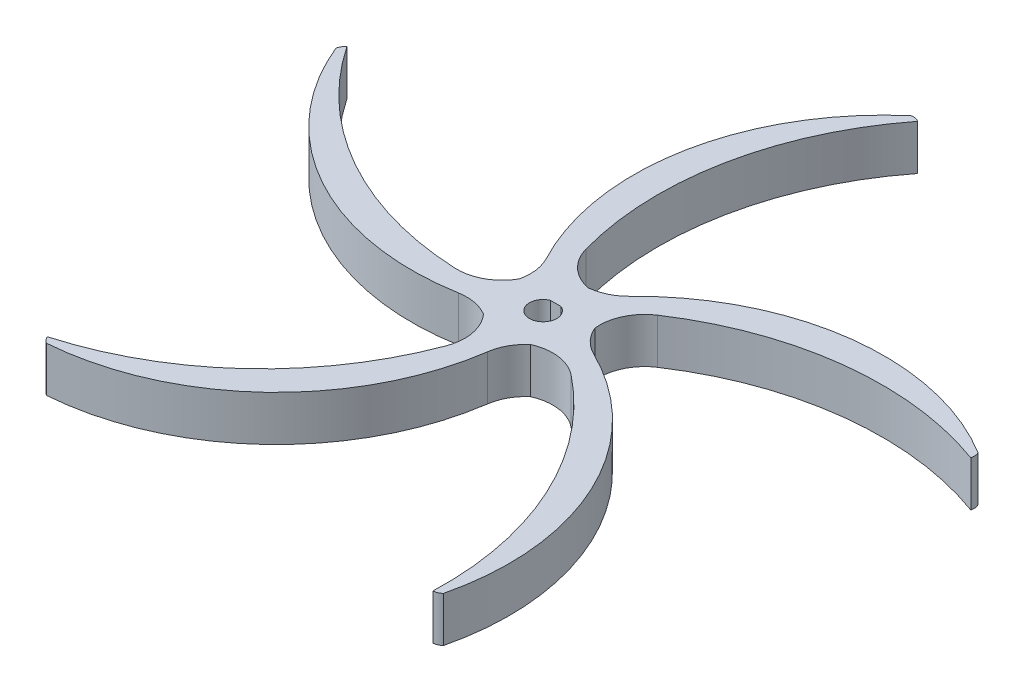
ISO-10303-21;
HEADER;
FILE_DESCRIPTION(('STEP AP214'),'2;1');
FILE_NAME('part.step','',(''),(''),'','','');
FILE_SCHEMA(('AUTOMOTIVE_DESIGN { 1 0 10303 214 1 1 1 1 }'));
ENDSEC;
DATA;
#1=APPLICATION_CONTEXT('core data for automotive mechanical design processes');
#2=APPLICATION_PROTOCOL_DEFINITION('international standard','automotive_design',2000,#1);
#3=PRODUCT_CONTEXT('',#1,'mechanical');
#4=PRODUCT('Part','Part','',(#3));
#5=PRODUCT_RELATED_PRODUCT_CATEGORY('part','',(#4));
#6=PRODUCT_DEFINITION_FORMATION('','',#4);
#7=PRODUCT_DEFINITION_CONTEXT('part definition',#1,'design');
#8=PRODUCT_DEFINITION('design','',#6,#7);
#9=PRODUCT_DEFINITION_SHAPE('','',#8);
#10=(LENGTH_UNIT() NAMED_UNIT(*) SI_UNIT(.MILLI.,.METRE.));
#11=(NAMED_UNIT(*) PLANE_ANGLE_UNIT() SI_UNIT($,.RADIAN.));
#12=(NAMED_UNIT(*) SI_UNIT($,.STERADIAN.) SOLID_ANGLE_UNIT());
#13=UNCERTAINTY_MEASURE_WITH_UNIT(LENGTH_MEASURE(1.E-05),#10,'distance_accuracy_value','');
#14=(GEOMETRIC_REPRESENTATION_CONTEXT(3) GLOBAL_UNCERTAINTY_ASSIGNED_CONTEXT((#13)) GLOBAL_UNIT_ASSIGNED_CONTEXT((#10,
#11,#12)) REPRESENTATION_CONTEXT('',''));
#15=CARTESIAN_POINT('',(0.,0.,0.));
#16=DIRECTION('',(0.,0.,1.));
#17=DIRECTION('',(1.,0.,0.));
#18=AXIS2_PLACEMENT_3D('',#15,#16,#17);
#19=CARTESIAN_POINT('',(0.,0.,0.));
#20=DIRECTION('',(0.,1.,0.));
#21=DIRECTION('',(0.,0.,1.));
#22=AXIS2_PLACEMENT_3D('',#19,#20,#21);
#23=PLANE('',#22);
#24=CARTESIAN_POINT('',(2.59805635797886,0.,-19.1456598362845));
#25=DIRECTION('',(0.,1.,0.));
#26=DIRECTION('',(0.,0.,1.));
#27=AXIS2_PLACEMENT_3D('',#24,#25,#26);
#28=CIRCLE('',#27,10.);
#29=CARTESIAN_POINT('',(-7.03824597740475,0.,-16.4732681544608));
#30=VERTEX_POINT('',#29);
#31=CARTESIAN_POINT('',(0.551785466364731,0.,-9.35725979142876));
#32=VERTEX_POINT('',#31);
#33=EDGE_CURVE('E444',#30,#32,#28,.T.);
#34=ORIENTED_EDGE('',*,*,#33,.T.);
#35=CARTESIAN_POINT('',(-0.329885574622799,0.,-19.3183167722659));
#36=DIRECTION('',(0.,1.,0.));
#37=DIRECTION('',(0.,0.,1.));
#38=AXIS2_PLACEMENT_3D('',#35,#36,#37);
#39=CIRCLE('',#38,10.);
#40=CARTESIAN_POINT('',(6.84598257952221,0.,-12.3536260946889));
#41=VERTEX_POINT('',#40);
#42=EDGE_CURVE('E447',#32,#41,#39,.T.);
#43=ORIENTED_EDGE('',*,*,#42,.T.);
#44=CARTESIAN_POINT('',(46.4009814470581,0.,26.0373150355719));
#45=DIRECTION('',(0.,1.,0.));
#46=DIRECTION('',(0.95105651629515,0.,-0.309016994374958));
#47=AXIS2_PLACEMENT_3D('',#44,#45,#46);
#48=CIRCLE('',#47,55.1222486504126);
#49=CARTESIAN_POINT('',(75.3173797078284,0.,-20.8913990731957));
#50=VERTEX_POINT('',#49);
#51=EDGE_CURVE('E260',#50,#41,#48,.T.);
#52=ORIENTED_EDGE('',*,*,#51,.F.);
#53=CARTESIAN_POINT('',(73.0753940921329,0.,-19.7803009962848));
#54=DIRECTION('',(0.,1.,0.));
#55=DIRECTION('',(0.95105651629515,0.,-0.309016994374958));
#56=AXIS2_PLACEMENT_3D('',#53,#54,#55);
#57=CIRCLE('',#56,2.50220671358312);
#58=CARTESIAN_POINT('',(75.4885456026814,0.,-19.1186831121264));
#59=VERTEX_POINT('',#58);
#60=EDGE_CURVE('E270',#59,#50,#57,.T.);
#61=ORIENTED_EDGE('',*,*,#60,.F.);
#62=CARTESIAN_POINT('',(51.7649077058266,0.,46.0395552573921));
#63=DIRECTION('',(0.,-1.,0.));
#64=DIRECTION('',(0.95105651629515,0.,-0.309016994374958));
#65=AXIS2_PLACEMENT_3D('',#62,#63,#64);
#66=CIRCLE('',#65,69.3426782182522);
#67=CARTESIAN_POINT('',(13.4920714053681,0.,-11.7842895127231));
#68=VERTEX_POINT('',#67);
#69=EDGE_CURVE('E254',#68,#59,#66,.T.);
#70=ORIENTED_EDGE('',*,*,#69,.F.);
#71=CARTESIAN_POINT('',(19.0114481130281,0.,-3.44543582897617));
#72=DIRECTION('',(0.,1.,0.));
#73=DIRECTION('',(0.,0.,1.));
#74=AXIS2_PLACEMENT_3D('',#71,#72,#73);
#75=CIRCLE('',#74,10.);
#76=CARTESIAN_POINT('',(9.06979398566074,0.,-2.36677313294975));
#77=VERTEX_POINT('',#76);
#78=EDGE_CURVE('E438',#68,#77,#75,.T.);
#79=ORIENTED_EDGE('',*,*,#78,.T.);
#80=CARTESIAN_POINT('',(18.2708708013598,0.,-6.28342801072549));
#81=DIRECTION('',(0.,1.,0.));
#82=DIRECTION('',(0.,0.,1.));
#83=AXIS2_PLACEMENT_3D('',#80,#81,#82);
#84=CIRCLE('',#83,10.);
#85=CARTESIAN_POINT('',(13.8645215574949,0.,2.69343593728504));
#86=VERTEX_POINT('',#85);
#87=EDGE_CURVE('E429',#77,#86,#84,.T.);
#88=ORIENTED_EDGE('',*,*,#87,.T.);
#89=CARTESIAN_POINT('',(-10.424266308593,0.,52.1759286016012));
#90=DIRECTION('',(0.,1.,0.));
#91=DIRECTION('',(0.58778525229248,0.,0.809016994374942));
#92=AXIS2_PLACEMENT_3D('',#89,#90,#91);
#93=CIRCLE('',#92,55.1222486504126);
#94=CARTESIAN_POINT('',(43.1432515245949,0.,65.1752874115201));
#95=VERTEX_POINT('',#94);
#96=EDGE_CURVE('E288',#95,#86,#93,.T.);
#97=ORIENTED_EDGE('',*,*,#96,.F.);
#98=CARTESIAN_POINT('',(41.3937228019117,0.,63.3863805704558));
#99=DIRECTION('',(0.,1.,0.));
#100=DIRECTION('',(0.58778525229248,0.,0.809016994374942));
#101=AXIS2_PLACEMENT_3D('',#98,#99,#100);
#102=CIRCLE('',#101,2.50220671358312);
#103=CARTESIAN_POINT('',(41.5101916286465,0.,65.8858752093577));
#104=VERTEX_POINT('',#103);
#105=EDGE_CURVE('E298',#104,#95,#102,.T.);
#106=ORIENTED_EDGE('',*,*,#105,.F.);
#107=CARTESIAN_POINT('',(-27.7899828415226,0.,63.4583577770421));
#108=DIRECTION('',(0.,-1.,0.));
#109=DIRECTION('',(0.58778525229248,0.,0.809016994374942));
#110=AXIS2_PLACEMENT_3D('',#107,#108,#109);
#111=CIRCLE('',#110,69.3426782182522);
#112=CARTESIAN_POINT('',(15.376804684563,0.,9.19017670232898));
#113=VERTEX_POINT('',#112);
#114=EDGE_CURVE('E283',#113,#104,#111,.T.);
#115=ORIENTED_EDGE('',*,*,#114,.F.);
#116=CARTESIAN_POINT('',(9.15166475122775,0.,17.0162633879207));
#117=DIRECTION('',(0.,1.,0.));
#118=DIRECTION('',(0.,0.,1.));
#119=AXIS2_PLACEMENT_3D('',#116,#117,#118);
#120=CIRCLE('',#119,10.);
#121=CARTESIAN_POINT('',(5.053655487733,0.,7.89451355160574));
#122=VERTEX_POINT('',#121);
#123=EDGE_CURVE('E11',#113,#122,#120,.T.);
#124=ORIENTED_EDGE('',*,*,#123,.T.);
#125=CARTESIAN_POINT('',(11.6219047339211,0.,15.4349446957744));
#126=DIRECTION('',(0.,1.,0.));
#127=DIRECTION('',(0.,0.,1.));
#128=AXIS2_PLACEMENT_3D('',#125,#126,#127);
#129=CIRCLE('',#128,10.);
#130=CARTESIAN_POINT('',(1.72276298076522,0.,14.0182610504515));
#131=VERTEX_POINT('',#130);
#132=EDGE_CURVE('E477',#122,#131,#129,.T.);
#133=ORIENTED_EDGE('',*,*,#132,.T.);
#134=CARTESIAN_POINT('',(-52.8435323335489,0.,6.2091822348051));
#135=DIRECTION('',(0.,1.,0.));
#136=DIRECTION('',(-0.587785252292469,0.,0.809016994374951));
#137=AXIS2_PLACEMENT_3D('',#134,#135,#136);
#138=CIRCLE('',#137,55.1222486504126);
#139=CARTESIAN_POINT('',(-48.6533838804433,0.,61.1719419200579));
#140=VERTEX_POINT('',#139);
#141=EDGE_CURVE('E316',#140,#131,#138,.T.);
#142=ORIENTED_EDGE('',*,*,#141,.F.);
#143=CARTESIAN_POINT('',(-47.4926664796602,0.,58.9552386126621));
#144=DIRECTION('',(0.,1.,0.));
#145=DIRECTION('',(-0.587785252292469,0.,0.809016994374951));
#146=AXIS2_PLACEMENT_3D('',#143,#144,#145);
#147=CIRCLE('',#146,2.50220671358312);
#148=CARTESIAN_POINT('',(-49.8338362966567,0.,59.8383933700433));
#149=VERTEX_POINT('',#148);
#150=EDGE_CURVE('E325',#149,#140,#147,.T.);
#151=ORIENTED_EDGE('',*,*,#150,.F.);
#152=CARTESIAN_POINT('',(-68.9400616486638,0.,-6.82013328092916));
#153=DIRECTION('',(0.,-1.,0.));
#154=DIRECTION('',(-0.587785252292469,0.,0.809016994374951));
#155=AXIS2_PLACEMENT_3D('',#152,#153,#154);
#156=CIRCLE('',#155,69.3426782182522);
#157=CARTESIAN_POINT('',(-3.98868347193967,0.,17.4641310773798));
#158=VERTEX_POINT('',#157);
#159=EDGE_CURVE('E311',#158,#149,#156,.T.);
#160=ORIENTED_EDGE('',*,*,#159,.F.);
#161=CARTESIAN_POINT('',(-13.3554082431251,0.,13.9620649642315));
#162=DIRECTION('',(0.,1.,0.));
#163=DIRECTION('',(0.,0.,1.));
#164=AXIS2_PLACEMENT_3D('',#161,#162,#163);
#165=CIRCLE('',#164,10.);
#166=CARTESIAN_POINT('',(-5.94646312680934,0.,7.24585083248871));
#167=VERTEX_POINT('',#166);
#168=EDGE_CURVE('E474',#158,#167,#165,.T.);
#169=ORIENTED_EDGE('',*,*,#168,.T.);
#170=CARTESIAN_POINT('',(-11.0881386617834,0.,15.8227484471889));
#171=DIRECTION('',(0.,1.,0.));
#172=DIRECTION('',(0.,0.,1.));
#173=AXIS2_PLACEMENT_3D('',#170,#171,#172);
#174=CIRCLE('',#173,10.);
#175=CARTESIAN_POINT('',(-12.799795480822,0.,5.97032585506269));
#176=VERTEX_POINT('',#175);
#177=EDGE_CURVE('E465',#167,#176,#174,.T.);
#178=ORIENTED_EDGE('',*,*,#177,.T.);
#179=CARTESIAN_POINT('',(-22.234832759144,0.,-48.3384429381496));
#180=DIRECTION('',(0.,1.,0.));
#181=DIRECTION('',(-0.951056516295155,0.,-0.309016994374945));
#182=AXIS2_PLACEMENT_3D('',#179,#180,#181);
#183=CIRCLE('',#182,55.1222486504126);
#184=CARTESIAN_POINT('',(-73.2126964304048,0.,-27.3689481470902));
#185=VERTEX_POINT('',#184);
#186=EDGE_CURVE('E343',#185,#176,#183,.T.);
#187=ORIENTED_EDGE('',*,*,#186,.F.);
#188=CARTESIAN_POINT('',(-70.7458049027042,0.,-26.9500392929708));
#189=DIRECTION('',(0.,1.,0.));
#190=DIRECTION('',(-0.951056516295155,0.,-0.309016994374945));
#191=AXIS2_PLACEMENT_3D('',#188,#189,#190);
#192=CIRCLE('',#191,2.50220671358312);
#193=CARTESIAN_POINT('',(-72.3091962497783,0.,-28.9037142744849));
#194=VERTEX_POINT('',#193);
#195=EDGE_CURVE('E353',#194,#185,#192,.T.);
#196=ORIENTED_EDGE('',*,*,#195,.F.);
#197=CARTESIAN_POINT('',(-14.8173184438644,0.,-67.6734319524606));
#198=DIRECTION('',(0.,-1.,0.));
#199=DIRECTION('',(-0.951056516295155,0.,-0.309016994374945));
#200=AXIS2_PLACEMENT_3D('',#197,#198,#199);
#201=CIRCLE('',#200,69.3426782182522);
#202=CARTESIAN_POINT('',(-17.8419466405866,0.,1.60324988747496));
#203=VERTEX_POINT('',#202);
#204=EDGE_CURVE('E338',#203,#194,#201,.T.);
#205=ORIENTED_EDGE('',*,*,#204,.F.);
#206=CARTESIAN_POINT('',(-17.4057609791095,0.,-8.3872326868916));
#207=DIRECTION('',(0.,1.,0.));
#208=DIRECTION('',(0.,0.,1.));
#209=AXIS2_PLACEMENT_3D('',#206,#207,#208);
#210=CIRCLE('',#209,10.);
#211=CARTESIAN_POINT('',(-8.72877181294912,0.,-3.41633145971603));
#212=VERTEX_POINT('',#211);
#213=EDGE_CURVE('E456',#203,#212,#210,.T.);
#214=ORIENTED_EDGE('',*,*,#213,.T.);
#215=CARTESIAN_POINT('',(-18.4747512988749,0.,-5.65594835997216));
#216=DIRECTION('',(0.,1.,0.));
#217=DIRECTION('',(0.,0.,1.));
#218=AXIS2_PLACEMENT_3D('',#215,#216,#217);
#219=CIRCLE('',#218,10.);
#220=CARTESIAN_POINT('',(-9.63347163696042,0.,-10.3283967481105));
#221=VERTEX_POINT('',#220);
#222=EDGE_CURVE('E459',#212,#221,#219,.T.);
#223=ORIENTED_EDGE('',*,*,#222,.T.);
#224=CARTESIAN_POINT('',(39.1016499542284,0.,-36.0839829338286));
#225=DIRECTION('',(0.,1.,0.));
#226=DIRECTION('',(0.,0.,-1.));
#227=AXIS2_PLACEMENT_3D('',#224,#225,#226);
#228=CIRCLE('',#227,55.1222486504126);
#229=CARTESIAN_POINT('',(3.4054490784254,0.,-78.086882111293));
#230=VERTEX_POINT('',#229);
#231=EDGE_CURVE('E371',#230,#221,#228,.T.);
#232=ORIENTED_EDGE('',*,*,#231,.F.);
#233=CARTESIAN_POINT('',(3.7693544883204,0.,-75.611278893863));
#234=DIRECTION('',(0.,1.,0.));
#235=DIRECTION('',(0.,0.,-1.));
#236=AXIS2_PLACEMENT_3D('',#233,#234,#235);
#237=CIRCLE('',#236,2.50220671358312);
#238=CARTESIAN_POINT('',(5.14429531510767,0.,-77.7018711927903));
#239=VERTEX_POINT('',#238);
#240=EDGE_CURVE('E381',#239,#230,#237,.T.);
#241=ORIENTED_EDGE('',*,*,#240,.F.);
#242=CARTESIAN_POINT('',(59.782455228225,0.,-35.0043478010443));
#243=DIRECTION('',(0.,-1.,0.));
#244=DIRECTION('',(0.,0.,-1.));
#245=AXIS2_PLACEMENT_3D('',#242,#243,#244);
#246=CIRCLE('',#245,69.3426782182522);
#247=EDGE_CURVE('E366',#30,#239,#246,.T.);
#248=ORIENTED_EDGE('',*,*,#247,.F.);
#249=EDGE_LOOP('',(#34,#43,#52,#61,#70,#79,#88,#97,#106,#115,#124,#133,#142,#151,#160,#169,#178,
#187,#196,#205,#214,#223,#232,#241,#248));
#250=FACE_BOUND('',#249,.T.);
#251=DIRECTION('',(1.,0.,0.));
#252=VECTOR('',#251,1.);
#253=CARTESIAN_POINT('',(0.,0.,-2.78));
#254=LINE('',#253,#252);
#255=CARTESIAN_POINT('',(-1.19257075261806,0.,-2.78));
#256=VERTEX_POINT('',#255);
#257=CARTESIAN_POINT('',(1.19257075261806,0.,-2.78));
#258=VERTEX_POINT('',#257);
#259=EDGE_CURVE('E229',#256,#258,#254,.T.);
#260=ORIENTED_EDGE('',*,*,#259,.F.);
#261=CARTESIAN_POINT('',(0.,0.,0.));
#262=DIRECTION('',(0.,1.,0.));
#263=DIRECTION('',(0.,0.,1.));
#264=AXIS2_PLACEMENT_3D('',#261,#262,#263);
#265=CIRCLE('',#264,3.025);
#266=EDGE_CURVE('E238',#256,#258,#265,.T.);
#267=ORIENTED_EDGE('',*,*,#266,.T.);
#268=EDGE_LOOP('',(#260,#267));
#269=FACE_BOUND('',#268,.T.);
#270=ADVANCED_FACE('F44',(#250,#269),#23,.F.);
#271=CARTESIAN_POINT('',(0.,10.,0.));
#272=DIRECTION('',(0.,1.,0.));
#273=DIRECTION('',(0.,0.,1.));
#274=AXIS2_PLACEMENT_3D('',#271,#272,#273);
#275=PLANE('',#274);
#276=CARTESIAN_POINT('',(18.2708708013598,10.,-6.28342801072549));
#277=DIRECTION('',(0.,1.,0.));
#278=DIRECTION('',(0.,0.,1.));
#279=AXIS2_PLACEMENT_3D('',#276,#277,#278);
#280=CIRCLE('',#279,10.);
#281=CARTESIAN_POINT('',(13.8645215574949,10.,2.69343593728504));
#282=VERTEX_POINT('',#281);
#283=CARTESIAN_POINT('',(9.06979398566074,10.,-2.36677313294975));
#284=VERTEX_POINT('',#283);
#285=EDGE_CURVE('E432',#282,#284,#280,.F.);
#286=ORIENTED_EDGE('',*,*,#285,.T.);
#287=CARTESIAN_POINT('',(19.0114481130281,10.,-3.44543582897617));
#288=DIRECTION('',(0.,1.,0.));
#289=DIRECTION('',(0.,0.,1.));
#290=AXIS2_PLACEMENT_3D('',#287,#288,#289);
#291=CIRCLE('',#290,10.);
#292=CARTESIAN_POINT('',(13.4920714053681,10.,-11.7842895127231));
#293=VERTEX_POINT('',#292);
#294=EDGE_CURVE('E435',#284,#293,#291,.F.);
#295=ORIENTED_EDGE('',*,*,#294,.T.);
#296=CARTESIAN_POINT('',(51.7649077058266,10.,46.0395552573921));
#297=DIRECTION('',(0.,-1.,0.));
#298=DIRECTION('',(0.95105651629515,0.,-0.309016994374958));
#299=AXIS2_PLACEMENT_3D('',#296,#297,#298);
#300=CIRCLE('',#299,69.3426782182522);
#301=CARTESIAN_POINT('',(75.4885456026814,10.,-19.1186831121264));
#302=VERTEX_POINT('',#301);
#303=EDGE_CURVE('E256',#293,#302,#300,.T.);
#304=ORIENTED_EDGE('',*,*,#303,.T.);
#305=CARTESIAN_POINT('',(73.0753940921329,10.,-19.7803009962848));
#306=DIRECTION('',(0.,1.,0.));
#307=DIRECTION('',(0.95105651629515,0.,-0.309016994374958));
#308=AXIS2_PLACEMENT_3D('',#305,#306,#307);
#309=CIRCLE('',#308,2.50220671358312);
#310=CARTESIAN_POINT('',(75.3173797078284,10.,-20.8913990731957));
#311=VERTEX_POINT('',#310);
#312=EDGE_CURVE('E259',#302,#311,#309,.T.);
#313=ORIENTED_EDGE('',*,*,#312,.T.);
#314=CARTESIAN_POINT('',(46.4009814470581,10.,26.0373150355719));
#315=DIRECTION('',(0.,1.,0.));
#316=DIRECTION('',(0.95105651629515,0.,-0.309016994374958));
#317=AXIS2_PLACEMENT_3D('',#314,#315,#316);
#318=CIRCLE('',#317,55.1222486504126);
#319=CARTESIAN_POINT('',(6.84598257952221,10.,-12.3536260946889));
#320=VERTEX_POINT('',#319);
#321=EDGE_CURVE('E263',#311,#320,#318,.T.);
#322=ORIENTED_EDGE('',*,*,#321,.T.);
#323=CARTESIAN_POINT('',(-0.329885574622799,10.,-19.3183167722659));
#324=DIRECTION('',(0.,1.,0.));
#325=DIRECTION('',(0.,0.,1.));
#326=AXIS2_PLACEMENT_3D('',#323,#324,#325);
#327=CIRCLE('',#326,10.);
#328=CARTESIAN_POINT('',(0.551785466364731,10.,-9.35725979142876));
#329=VERTEX_POINT('',#328);
#330=EDGE_CURVE('E450',#320,#329,#327,.F.);
#331=ORIENTED_EDGE('',*,*,#330,.T.);
#332=CARTESIAN_POINT('',(2.59805635797886,10.,-19.1456598362845));
#333=DIRECTION('',(0.,1.,0.));
#334=DIRECTION('',(0.,0.,1.));
#335=AXIS2_PLACEMENT_3D('',#332,#333,#334);
#336=CIRCLE('',#335,10.);
#337=CARTESIAN_POINT('',(-7.03824597740475,10.,-16.4732681544608));
#338=VERTEX_POINT('',#337);
#339=EDGE_CURVE('E441',#329,#338,#336,.F.);
#340=ORIENTED_EDGE('',*,*,#339,.T.);
#341=CARTESIAN_POINT('',(59.782455228225,10.,-35.0043478010443));
#342=DIRECTION('',(0.,-1.,0.));
#343=DIRECTION('',(0.,0.,-1.));
#344=AXIS2_PLACEMENT_3D('',#341,#342,#343);
#345=CIRCLE('',#344,69.3426782182522);
#346=CARTESIAN_POINT('',(5.14429531510767,10.,-77.7018711927903));
#347=VERTEX_POINT('',#346);
#348=EDGE_CURVE('E367',#338,#347,#345,.T.);
#349=ORIENTED_EDGE('',*,*,#348,.T.);
#350=CARTESIAN_POINT('',(3.7693544883204,10.,-75.611278893863));
#351=DIRECTION('',(0.,1.,0.));
#352=DIRECTION('',(0.,0.,-1.));
#353=AXIS2_PLACEMENT_3D('',#350,#351,#352);
#354=CIRCLE('',#353,2.50220671358312);
#355=CARTESIAN_POINT('',(3.4054490784254,10.,-78.086882111293));
#356=VERTEX_POINT('',#355);
#357=EDGE_CURVE('E370',#347,#356,#354,.T.);
#358=ORIENTED_EDGE('',*,*,#357,.T.);
#359=CARTESIAN_POINT('',(39.1016499542284,10.,-36.0839829338286));
#360=DIRECTION('',(0.,1.,0.));
#361=DIRECTION('',(0.,0.,-1.));
#362=AXIS2_PLACEMENT_3D('',#359,#360,#361);
#363=CIRCLE('',#362,55.1222486504126);
#364=CARTESIAN_POINT('',(-9.63347163696042,10.,-10.3283967481105));
#365=VERTEX_POINT('',#364);
#366=EDGE_CURVE('E374',#356,#365,#363,.T.);
#367=ORIENTED_EDGE('',*,*,#366,.T.);
#368=CARTESIAN_POINT('',(-18.4747512988749,10.,-5.65594835997216));
#369=DIRECTION('',(0.,1.,0.));
#370=DIRECTION('',(0.,0.,1.));
#371=AXIS2_PLACEMENT_3D('',#368,#369,#370);
#372=CIRCLE('',#371,10.);
#373=CARTESIAN_POINT('',(-8.72877181294912,10.,-3.41633145971603));
#374=VERTEX_POINT('',#373);
#375=EDGE_CURVE('E462',#365,#374,#372,.F.);
#376=ORIENTED_EDGE('',*,*,#375,.T.);
#377=CARTESIAN_POINT('',(-17.4057609791095,10.,-8.3872326868916));
#378=DIRECTION('',(0.,1.,0.));
#379=DIRECTION('',(0.,0.,1.));
#380=AXIS2_PLACEMENT_3D('',#377,#378,#379);
#381=CIRCLE('',#380,10.);
#382=CARTESIAN_POINT('',(-17.8419466405866,10.,1.60324988747496));
#383=VERTEX_POINT('',#382);
#384=EDGE_CURVE('E453',#374,#383,#381,.F.);
#385=ORIENTED_EDGE('',*,*,#384,.T.);
#386=CARTESIAN_POINT('',(-14.8173184438644,10.,-67.6734319524606));
#387=DIRECTION('',(0.,-1.,0.));
#388=DIRECTION('',(-0.951056516295155,0.,-0.309016994374945));
#389=AXIS2_PLACEMENT_3D('',#386,#387,#388);
#390=CIRCLE('',#389,69.3426782182522);
#391=CARTESIAN_POINT('',(-72.3091962497783,10.,-28.9037142744849));
#392=VERTEX_POINT('',#391);
#393=EDGE_CURVE('E339',#383,#392,#390,.T.);
#394=ORIENTED_EDGE('',*,*,#393,.T.);
#395=CARTESIAN_POINT('',(-70.7458049027042,10.,-26.9500392929708));
#396=DIRECTION('',(0.,1.,0.));
#397=DIRECTION('',(-0.951056516295155,0.,-0.309016994374945));
#398=AXIS2_PLACEMENT_3D('',#395,#396,#397);
#399=CIRCLE('',#398,2.50220671358312);
#400=CARTESIAN_POINT('',(-73.2126964304048,10.,-27.3689481470902));
#401=VERTEX_POINT('',#400);
#402=EDGE_CURVE('E342',#392,#401,#399,.T.);
#403=ORIENTED_EDGE('',*,*,#402,.T.);
#404=CARTESIAN_POINT('',(-22.234832759144,10.,-48.3384429381496));
#405=DIRECTION('',(0.,1.,0.));
#406=DIRECTION('',(-0.951056516295155,0.,-0.309016994374945));
#407=AXIS2_PLACEMENT_3D('',#404,#405,#406);
#408=CIRCLE('',#407,55.1222486504126);
#409=CARTESIAN_POINT('',(-12.799795480822,10.,5.97032585506269));
#410=VERTEX_POINT('',#409);
#411=EDGE_CURVE('E346',#401,#410,#408,.T.);
#412=ORIENTED_EDGE('',*,*,#411,.T.);
#413=CARTESIAN_POINT('',(-11.0881386617834,10.,15.8227484471889));
#414=DIRECTION('',(0.,1.,0.));
#415=DIRECTION('',(0.,0.,1.));
#416=AXIS2_PLACEMENT_3D('',#413,#414,#415);
#417=CIRCLE('',#416,10.);
#418=CARTESIAN_POINT('',(-5.94646312680934,10.,7.24585083248871));
#419=VERTEX_POINT('',#418);
#420=EDGE_CURVE('E468',#410,#419,#417,.F.);
#421=ORIENTED_EDGE('',*,*,#420,.T.);
#422=CARTESIAN_POINT('',(-13.3554082431251,10.,13.9620649642315));
#423=DIRECTION('',(0.,1.,0.));
#424=DIRECTION('',(0.,0.,1.));
#425=AXIS2_PLACEMENT_3D('',#422,#423,#424);
#426=CIRCLE('',#425,10.);
#427=CARTESIAN_POINT('',(-3.98868347193967,10.,17.4641310773798));
#428=VERTEX_POINT('',#427);
#429=EDGE_CURVE('E471',#419,#428,#426,.F.);
#430=ORIENTED_EDGE('',*,*,#429,.T.);
#431=CARTESIAN_POINT('',(-68.9400616486638,10.,-6.82013328092916));
#432=DIRECTION('',(0.,-1.,0.));
#433=DIRECTION('',(-0.587785252292469,0.,0.809016994374951));
#434=AXIS2_PLACEMENT_3D('',#431,#432,#433);
#435=CIRCLE('',#434,69.3426782182522);
#436=CARTESIAN_POINT('',(-49.8338362966567,10.,59.8383933700433));
#437=VERTEX_POINT('',#436);
#438=EDGE_CURVE('E312',#428,#437,#435,.T.);
#439=ORIENTED_EDGE('',*,*,#438,.T.);
#440=CARTESIAN_POINT('',(-47.4926664796602,10.,58.9552386126621));
#441=DIRECTION('',(0.,1.,0.));
#442=DIRECTION('',(-0.587785252292469,0.,0.809016994374951));
#443=AXIS2_PLACEMENT_3D('',#440,#441,#442);
#444=CIRCLE('',#443,2.50220671358312);
#445=CARTESIAN_POINT('',(-48.6533838804433,10.,61.1719419200579));
#446=VERTEX_POINT('',#445);
#447=EDGE_CURVE('E315',#437,#446,#444,.T.);
#448=ORIENTED_EDGE('',*,*,#447,.T.);
#449=CARTESIAN_POINT('',(-52.8435323335489,10.,6.2091822348051));
#450=DIRECTION('',(0.,1.,0.));
#451=DIRECTION('',(-0.587785252292469,0.,0.809016994374951));
#452=AXIS2_PLACEMENT_3D('',#449,#450,#451);
#453=CIRCLE('',#452,55.1222486504126);
#454=CARTESIAN_POINT('',(1.72276298076522,10.,14.0182610504515));
#455=VERTEX_POINT('',#454);
#456=EDGE_CURVE('E319',#446,#455,#453,.T.);
#457=ORIENTED_EDGE('',*,*,#456,.T.);
#458=CARTESIAN_POINT('',(11.6219047339211,10.,15.4349446957744));
#459=DIRECTION('',(0.,1.,0.));
#460=DIRECTION('',(0.,0.,1.));
#461=AXIS2_PLACEMENT_3D('',#458,#459,#460);
#462=CIRCLE('',#461,10.);
#463=CARTESIAN_POINT('',(5.053655487733,10.,7.89451355160574));
#464=VERTEX_POINT('',#463);
#465=EDGE_CURVE('E62',#455,#464,#462,.F.);
#466=ORIENTED_EDGE('',*,*,#465,.T.);
#467=CARTESIAN_POINT('',(9.15166475122775,10.,17.0162633879207));
#468=DIRECTION('',(0.,1.,0.));
#469=DIRECTION('',(0.,0.,1.));
#470=AXIS2_PLACEMENT_3D('',#467,#468,#469);
#471=CIRCLE('',#470,10.);
#472=CARTESIAN_POINT('',(15.376804684563,10.,9.19017670232898));
#473=VERTEX_POINT('',#472);
#474=EDGE_CURVE('E54',#464,#473,#471,.F.);
#475=ORIENTED_EDGE('',*,*,#474,.T.);
#476=CARTESIAN_POINT('',(-27.7899828415226,10.,63.4583577770421));
#477=DIRECTION('',(0.,-1.,0.));
#478=DIRECTION('',(0.58778525229248,0.,0.809016994374942));
#479=AXIS2_PLACEMENT_3D('',#476,#477,#478);
#480=CIRCLE('',#479,69.3426782182522);
#481=CARTESIAN_POINT('',(41.5101916286465,10.,65.8858752093577));
#482=VERTEX_POINT('',#481);
#483=EDGE_CURVE('E284',#473,#482,#480,.T.);
#484=ORIENTED_EDGE('',*,*,#483,.T.);
#485=CARTESIAN_POINT('',(41.3937228019117,10.,63.3863805704558));
#486=DIRECTION('',(0.,1.,0.));
#487=DIRECTION('',(0.58778525229248,0.,0.809016994374942));
#488=AXIS2_PLACEMENT_3D('',#485,#486,#487);
#489=CIRCLE('',#488,2.50220671358312);
#490=CARTESIAN_POINT('',(43.1432515245949,10.,65.1752874115201));
#491=VERTEX_POINT('',#490);
#492=EDGE_CURVE('E287',#482,#491,#489,.T.);
#493=ORIENTED_EDGE('',*,*,#492,.T.);
#494=CARTESIAN_POINT('',(-10.424266308593,10.,52.1759286016012));
#495=DIRECTION('',(0.,1.,0.));
#496=DIRECTION('',(0.58778525229248,0.,0.809016994374942));
#497=AXIS2_PLACEMENT_3D('',#494,#495,#496);
#498=CIRCLE('',#497,55.1222486504126);
#499=EDGE_CURVE('E291',#491,#282,#498,.T.);
#500=ORIENTED_EDGE('',*,*,#499,.T.);
#501=EDGE_LOOP('',(#286,#295,#304,#313,#322,#331,#340,#349,#358,#367,#376,#385,#394,#403,#412,
#421,#430,#439,#448,#457,#466,#475,#484,#493,#500));
#502=FACE_BOUND('',#501,.T.);
#503=CARTESIAN_POINT('',(0.,10.,0.));
#504=DIRECTION('',(0.,1.,0.));
#505=DIRECTION('',(0.,0.,1.));
#506=AXIS2_PLACEMENT_3D('',#503,#504,#505);
#507=CIRCLE('',#506,3.025);
#508=CARTESIAN_POINT('',(-1.19257075261806,10.,-2.78));
#509=VERTEX_POINT('',#508);
#510=CARTESIAN_POINT('',(1.19257075261806,10.,-2.78));
#511=VERTEX_POINT('',#510);
#512=EDGE_CURVE('E245',#509,#511,#507,.T.);
#513=ORIENTED_EDGE('',*,*,#512,.F.);
#514=DIRECTION('',(1.,0.,0.));
#515=VECTOR('',#514,1.);
#516=CARTESIAN_POINT('',(0.,10.,-2.78));
#517=LINE('',#516,#515);
#518=EDGE_CURVE('E232',#509,#511,#517,.T.);
#519=ORIENTED_EDGE('',*,*,#518,.T.);
#520=EDGE_LOOP('',(#513,#519));
#521=FACE_BOUND('',#520,.T.);
#522=ADVANCED_FACE('F509',(#502,#521),#275,.T.);
#523=CARTESIAN_POINT('',(59.782455228225,10.,-35.0043478010443));
#524=DIRECTION('',(0.,-1.,0.));
#525=DIRECTION('',(0.,0.,-1.));
#526=AXIS2_PLACEMENT_3D('',#523,#524,#525);
#527=CYLINDRICAL_SURFACE('',#526,69.3426782182522);
#528=ORIENTED_EDGE('',*,*,#348,.F.);
#529=DIRECTION('',(0.,-1.,0.));
#530=VECTOR('',#529,1.);
#531=CARTESIAN_POINT('',(-7.03824597740475,10.,-16.4732681544608));
#532=LINE('',#531,#530);
#533=EDGE_CURVE('E401',#338,#30,#532,.T.);
#534=ORIENTED_EDGE('',*,*,#533,.T.);
#535=ORIENTED_EDGE('',*,*,#247,.T.);
#536=DIRECTION('',(0.,-1.,0.));
#537=VECTOR('',#536,1.);
#538=CARTESIAN_POINT('',(5.14429531510767,10.,-77.7018711927903));
#539=LINE('',#538,#537);
#540=EDGE_CURVE('E390',#347,#239,#539,.T.);
#541=ORIENTED_EDGE('',*,*,#540,.F.);
#542=EDGE_LOOP('',(#528,#534,#535,#541));
#543=FACE_BOUND('',#542,.T.);
#544=ADVANCED_FACE('F558',(#543),#527,.F.);
#545=CARTESIAN_POINT('',(3.7693544883204,10.,-75.611278893863));
#546=DIRECTION('',(0.,-1.,0.));
#547=DIRECTION('',(0.,0.,-1.));
#548=AXIS2_PLACEMENT_3D('',#545,#546,#547);
#549=CYLINDRICAL_SURFACE('',#548,2.50220671358312);
#550=ORIENTED_EDGE('',*,*,#240,.T.);
#551=DIRECTION('',(0.,-1.,0.));
#552=VECTOR('',#551,1.);
#553=CARTESIAN_POINT('',(3.4054490784254,10.,-78.086882111293));
#554=LINE('',#553,#552);
#555=EDGE_CURVE('E378',#356,#230,#554,.T.);
#556=ORIENTED_EDGE('',*,*,#555,.F.);
#557=ORIENTED_EDGE('',*,*,#357,.F.);
#558=ORIENTED_EDGE('',*,*,#540,.T.);
#559=EDGE_LOOP('',(#550,#556,#557,#558));
#560=FACE_BOUND('',#559,.T.);
#561=ADVANCED_FACE('F564',(#560),#549,.T.);
#562=CARTESIAN_POINT('',(39.1016499542284,10.,-36.0839829338286));
#563=DIRECTION('',(0.,-1.,0.));
#564=DIRECTION('',(0.,0.,-1.));
#565=AXIS2_PLACEMENT_3D('',#562,#563,#564);
#566=CYLINDRICAL_SURFACE('',#565,55.1222486504126);
#567=ORIENTED_EDGE('',*,*,#231,.T.);
#568=DIRECTION('',(0.,-1.,0.));
#569=VECTOR('',#568,1.);
#570=CARTESIAN_POINT('',(-9.63347163696043,10.,-10.3283967481105));
#571=LINE('',#570,#569);
#572=EDGE_CURVE('E412',#221,#365,#571,.F.);
#573=ORIENTED_EDGE('',*,*,#572,.T.);
#574=ORIENTED_EDGE('',*,*,#366,.F.);
#575=ORIENTED_EDGE('',*,*,#555,.T.);
#576=EDGE_LOOP('',(#567,#573,#574,#575));
#577=FACE_BOUND('',#576,.T.);
#578=ADVANCED_FACE('F775',(#577),#566,.T.);
#579=CARTESIAN_POINT('',(-14.8173184438644,10.,-67.6734319524606));
#580=DIRECTION('',(0.,-1.,0.));
#581=DIRECTION('',(-0.951056516295155,0.,-0.309016994374945));
#582=AXIS2_PLACEMENT_3D('',#579,#580,#581);
#583=CYLINDRICAL_SURFACE('',#582,69.3426782182522);
#584=ORIENTED_EDGE('',*,*,#393,.F.);
#585=DIRECTION('',(0.,-1.,0.));
#586=VECTOR('',#585,1.);
#587=CARTESIAN_POINT('',(-17.8419466405866,10.,1.60324988747496));
#588=LINE('',#587,#586);
#589=EDGE_CURVE('E408',#383,#203,#588,.T.);
#590=ORIENTED_EDGE('',*,*,#589,.T.);
#591=ORIENTED_EDGE('',*,*,#204,.T.);
#592=DIRECTION('',(0.,-1.,0.));
#593=VECTOR('',#592,1.);
#594=CARTESIAN_POINT('',(-72.3091962497783,10.,-28.9037142744849));
#595=LINE('',#594,#593);
#596=EDGE_CURVE('E362',#392,#194,#595,.T.);
#597=ORIENTED_EDGE('',*,*,#596,.F.);
#598=EDGE_LOOP('',(#584,#590,#591,#597));
#599=FACE_BOUND('',#598,.T.);
#600=ADVANCED_FACE('F580',(#599),#583,.F.);
#601=CARTESIAN_POINT('',(-70.7458049027042,10.,-26.9500392929708));
#602=DIRECTION('',(0.,-1.,0.));
#603=DIRECTION('',(-0.951056516295155,0.,-0.309016994374945));
#604=AXIS2_PLACEMENT_3D('',#601,#602,#603);
#605=CYLINDRICAL_SURFACE('',#604,2.50220671358312);
#606=ORIENTED_EDGE('',*,*,#195,.T.);
#607=DIRECTION('',(0.,-1.,0.));
#608=VECTOR('',#607,1.);
#609=CARTESIAN_POINT('',(-73.2126964304048,10.,-27.3689481470902));
#610=LINE('',#609,#608);
#611=EDGE_CURVE('E350',#401,#185,#610,.T.);
#612=ORIENTED_EDGE('',*,*,#611,.F.);
#613=ORIENTED_EDGE('',*,*,#402,.F.);
#614=ORIENTED_EDGE('',*,*,#596,.T.);
#615=EDGE_LOOP('',(#606,#612,#613,#614));
#616=FACE_BOUND('',#615,.T.);
#617=ADVANCED_FACE('F586',(#616),#605,.T.);
#618=CARTESIAN_POINT('',(-22.234832759144,10.,-48.3384429381496));
#619=DIRECTION('',(0.,-1.,0.));
#620=DIRECTION('',(-0.951056516295155,0.,-0.309016994374945));
#621=AXIS2_PLACEMENT_3D('',#618,#619,#620);
#622=CYLINDRICAL_SURFACE('',#621,55.1222486504126);
#623=ORIENTED_EDGE('',*,*,#186,.T.);
#624=DIRECTION('',(0.,-1.,0.));
#625=VECTOR('',#624,1.);
#626=CARTESIAN_POINT('',(-12.799795480822,10.,5.97032585506269));
#627=LINE('',#626,#625);
#628=EDGE_CURVE('E415',#176,#410,#627,.F.);
#629=ORIENTED_EDGE('',*,*,#628,.T.);
#630=ORIENTED_EDGE('',*,*,#411,.F.);
#631=ORIENTED_EDGE('',*,*,#611,.T.);
#632=EDGE_LOOP('',(#623,#629,#630,#631));
#633=FACE_BOUND('',#632,.T.);
#634=ADVANCED_FACE('F590',(#633),#622,.T.);
#635=CARTESIAN_POINT('',(-68.9400616486638,10.,-6.82013328092916));
#636=DIRECTION('',(0.,-1.,0.));
#637=DIRECTION('',(-0.587785252292469,0.,0.809016994374951));
#638=AXIS2_PLACEMENT_3D('',#635,#636,#637);
#639=CYLINDRICAL_SURFACE('',#638,69.3426782182522);
#640=ORIENTED_EDGE('',*,*,#438,.F.);
#641=DIRECTION('',(0.,-1.,0.));
#642=VECTOR('',#641,1.);
#643=CARTESIAN_POINT('',(-3.98868347193966,10.,17.4641310773798));
#644=LINE('',#643,#642);
#645=EDGE_CURVE('E419',#428,#158,#644,.T.);
#646=ORIENTED_EDGE('',*,*,#645,.T.);
#647=ORIENTED_EDGE('',*,*,#159,.T.);
#648=DIRECTION('',(0.,-1.,0.));
#649=VECTOR('',#648,1.);
#650=CARTESIAN_POINT('',(-49.8338362966567,10.,59.8383933700433));
#651=LINE('',#650,#649);
#652=EDGE_CURVE('E334',#437,#149,#651,.T.);
#653=ORIENTED_EDGE('',*,*,#652,.F.);
#654=EDGE_LOOP('',(#640,#646,#647,#653));
#655=FACE_BOUND('',#654,.T.);
#656=ADVANCED_FACE('F603',(#655),#639,.F.);
#657=CARTESIAN_POINT('',(-47.4926664796602,10.,58.9552386126621));
#658=DIRECTION('',(0.,-1.,0.));
#659=DIRECTION('',(-0.587785252292469,0.,0.809016994374951));
#660=AXIS2_PLACEMENT_3D('',#657,#658,#659);
#661=CYLINDRICAL_SURFACE('',#660,2.50220671358312);
#662=ORIENTED_EDGE('',*,*,#150,.T.);
#663=DIRECTION('',(0.,-1.,0.));
#664=VECTOR('',#663,1.);
#665=CARTESIAN_POINT('',(-48.6533838804433,10.,61.1719419200579));
#666=LINE('',#665,#664);
#667=EDGE_CURVE('E322',#446,#140,#666,.T.);
#668=ORIENTED_EDGE('',*,*,#667,.F.);
#669=ORIENTED_EDGE('',*,*,#447,.F.);
#670=ORIENTED_EDGE('',*,*,#652,.T.);
#671=EDGE_LOOP('',(#662,#668,#669,#670));
#672=FACE_BOUND('',#671,.T.);
#673=ADVANCED_FACE('F607',(#672),#661,.T.);
#674=CARTESIAN_POINT('',(-52.8435323335489,10.,6.2091822348051));
#675=DIRECTION('',(0.,-1.,0.));
#676=DIRECTION('',(-0.587785252292469,0.,0.809016994374951));
#677=AXIS2_PLACEMENT_3D('',#674,#675,#676);
#678=CYLINDRICAL_SURFACE('',#677,55.1222486504126);
#679=ORIENTED_EDGE('',*,*,#141,.T.);
#680=DIRECTION('',(0.,-1.,0.));
#681=VECTOR('',#680,1.);
#682=CARTESIAN_POINT('',(1.72276298076523,10.,14.0182610504515));
#683=LINE('',#682,#681);
#684=EDGE_CURVE('E422',#131,#455,#683,.F.);
#685=ORIENTED_EDGE('',*,*,#684,.T.);
#686=ORIENTED_EDGE('',*,*,#456,.F.);
#687=ORIENTED_EDGE('',*,*,#667,.T.);
#688=EDGE_LOOP('',(#679,#685,#686,#687));
#689=FACE_BOUND('',#688,.T.);
#690=ADVANCED_FACE('F610',(#689),#678,.T.);
#691=CARTESIAN_POINT('',(-27.7899828415226,10.,63.4583577770421));
#692=DIRECTION('',(0.,-1.,0.));
#693=DIRECTION('',(0.58778525229248,0.,0.809016994374942));
#694=AXIS2_PLACEMENT_3D('',#691,#692,#693);
#695=CYLINDRICAL_SURFACE('',#694,69.3426782182522);
#696=ORIENTED_EDGE('',*,*,#483,.F.);
#697=DIRECTION('',(0.,-1.,0.));
#698=VECTOR('',#697,1.);
#699=CARTESIAN_POINT('',(15.376804684563,10.,9.19017670232898));
#700=LINE('',#699,#698);
#701=EDGE_CURVE('E426',#473,#113,#700,.T.);
#702=ORIENTED_EDGE('',*,*,#701,.T.);
#703=ORIENTED_EDGE('',*,*,#114,.T.);
#704=DIRECTION('',(0.,-1.,0.));
#705=VECTOR('',#704,1.);
#706=CARTESIAN_POINT('',(41.5101916286465,10.,65.8858752093577));
#707=LINE('',#706,#705);
#708=EDGE_CURVE('E307',#482,#104,#707,.T.);
#709=ORIENTED_EDGE('',*,*,#708,.F.);
#710=EDGE_LOOP('',(#696,#702,#703,#709));
#711=FACE_BOUND('',#710,.T.);
#712=ADVANCED_FACE('F513',(#711),#695,.F.);
#713=CARTESIAN_POINT('',(41.3937228019117,10.,63.3863805704558));
#714=DIRECTION('',(0.,-1.,0.));
#715=DIRECTION('',(0.58778525229248,0.,0.809016994374942));
#716=AXIS2_PLACEMENT_3D('',#713,#714,#715);
#717=CYLINDRICAL_SURFACE('',#716,2.50220671358312);
#718=ORIENTED_EDGE('',*,*,#105,.T.);
#719=DIRECTION('',(0.,-1.,0.));
#720=VECTOR('',#719,1.);
#721=CARTESIAN_POINT('',(43.1432515245949,10.,65.1752874115201));
#722=LINE('',#721,#720);
#723=EDGE_CURVE('E295',#491,#95,#722,.T.);
#724=ORIENTED_EDGE('',*,*,#723,.F.);
#725=ORIENTED_EDGE('',*,*,#492,.F.);
#726=ORIENTED_EDGE('',*,*,#708,.T.);
#727=EDGE_LOOP('',(#718,#724,#725,#726));
#728=FACE_BOUND('',#727,.T.);
#729=ADVANCED_FACE('F518',(#728),#717,.T.);
#730=CARTESIAN_POINT('',(-10.424266308593,10.,52.1759286016012));
#731=DIRECTION('',(0.,-1.,0.));
#732=DIRECTION('',(0.58778525229248,0.,0.809016994374942));
#733=AXIS2_PLACEMENT_3D('',#730,#731,#732);
#734=CYLINDRICAL_SURFACE('',#733,55.1222486504126);
#735=ORIENTED_EDGE('',*,*,#96,.T.);
#736=DIRECTION('',(0.,-1.,0.));
#737=VECTOR('',#736,1.);
#738=CARTESIAN_POINT('',(13.8645215574949,10.,2.69343593728504));
#739=LINE('',#738,#737);
#740=EDGE_CURVE('E394',#86,#282,#739,.F.);
#741=ORIENTED_EDGE('',*,*,#740,.T.);
#742=ORIENTED_EDGE('',*,*,#499,.F.);
#743=ORIENTED_EDGE('',*,*,#723,.T.);
#744=EDGE_LOOP('',(#735,#741,#742,#743));
#745=FACE_BOUND('',#744,.T.);
#746=ADVANCED_FACE('F522',(#745),#734,.T.);
#747=CARTESIAN_POINT('',(51.7649077058266,10.,46.0395552573921));
#748=DIRECTION('',(0.,-1.,0.));
#749=DIRECTION('',(0.95105651629515,0.,-0.309016994374958));
#750=AXIS2_PLACEMENT_3D('',#747,#748,#749);
#751=CYLINDRICAL_SURFACE('',#750,69.3426782182522);
#752=ORIENTED_EDGE('',*,*,#303,.F.);
#753=DIRECTION('',(0.,-1.,0.));
#754=VECTOR('',#753,1.);
#755=CARTESIAN_POINT('',(13.4920714053681,10.,-11.7842895127231));
#756=LINE('',#755,#754);
#757=EDGE_CURVE('E398',#293,#68,#756,.T.);
#758=ORIENTED_EDGE('',*,*,#757,.T.);
#759=ORIENTED_EDGE('',*,*,#69,.T.);
#760=DIRECTION('',(0.,-1.,0.));
#761=VECTOR('',#760,1.);
#762=CARTESIAN_POINT('',(75.4885456026814,10.,-19.1186831121264));
#763=LINE('',#762,#761);
#764=EDGE_CURVE('E279',#302,#59,#763,.T.);
#765=ORIENTED_EDGE('',*,*,#764,.F.);
#766=EDGE_LOOP('',(#752,#758,#759,#765));
#767=FACE_BOUND('',#766,.T.);
#768=ADVANCED_FACE('F536',(#767),#751,.F.);
#769=CARTESIAN_POINT('',(73.0753940921329,10.,-19.7803009962848));
#770=DIRECTION('',(0.,-1.,0.));
#771=DIRECTION('',(0.95105651629515,0.,-0.309016994374958));
#772=AXIS2_PLACEMENT_3D('',#769,#770,#771);
#773=CYLINDRICAL_SURFACE('',#772,2.50220671358312);
#774=ORIENTED_EDGE('',*,*,#60,.T.);
#775=DIRECTION('',(0.,-1.,0.));
#776=VECTOR('',#775,1.);
#777=CARTESIAN_POINT('',(75.3173797078284,10.,-20.8913990731957));
#778=LINE('',#777,#776);
#779=EDGE_CURVE('E267',#311,#50,#778,.T.);
#780=ORIENTED_EDGE('',*,*,#779,.F.);
#781=ORIENTED_EDGE('',*,*,#312,.F.);
#782=ORIENTED_EDGE('',*,*,#764,.T.);
#783=EDGE_LOOP('',(#774,#780,#781,#782));
#784=FACE_BOUND('',#783,.T.);
#785=ADVANCED_FACE('F542',(#784),#773,.T.);
#786=CARTESIAN_POINT('',(46.4009814470581,10.,26.0373150355719));
#787=DIRECTION('',(0.,-1.,0.));
#788=DIRECTION('',(0.95105651629515,0.,-0.309016994374958));
#789=AXIS2_PLACEMENT_3D('',#786,#787,#788);
#790=CYLINDRICAL_SURFACE('',#789,55.1222486504126);
#791=ORIENTED_EDGE('',*,*,#51,.T.);
#792=DIRECTION('',(0.,-1.,0.));
#793=VECTOR('',#792,1.);
#794=CARTESIAN_POINT('',(6.84598257952221,10.,-12.3536260946889));
#795=LINE('',#794,#793);
#796=EDGE_CURVE('E405',#41,#320,#795,.F.);
#797=ORIENTED_EDGE('',*,*,#796,.T.);
#798=ORIENTED_EDGE('',*,*,#321,.F.);
#799=ORIENTED_EDGE('',*,*,#779,.T.);
#800=EDGE_LOOP('',(#791,#797,#798,#799));
#801=FACE_BOUND('',#800,.T.);
#802=ADVANCED_FACE('F695',(#801),#790,.T.);
#803=CARTESIAN_POINT('',(0.,0.,-2.78));
#804=DIRECTION('',(0.,0.,1.));
#805=DIRECTION('',(1.,0.,0.));
#806=AXIS2_PLACEMENT_3D('',#803,#804,#805);
#807=PLANE('',#806);
#808=ORIENTED_EDGE('',*,*,#518,.F.);
#809=DIRECTION('',(0.,1.,0.));
#810=VECTOR('',#809,1.);
#811=CARTESIAN_POINT('',(-1.19257075261806,0.,-2.78));
#812=LINE('',#811,#810);
#813=EDGE_CURVE('E225',#256,#509,#812,.T.);
#814=ORIENTED_EDGE('',*,*,#813,.F.);
#815=ORIENTED_EDGE('',*,*,#259,.T.);
#816=DIRECTION('',(0.,1.,0.));
#817=VECTOR('',#816,1.);
#818=CARTESIAN_POINT('',(1.19257075261806,0.,-2.78));
#819=LINE('',#818,#817);
#820=EDGE_CURVE('E237',#258,#511,#819,.T.);
#821=ORIENTED_EDGE('',*,*,#820,.T.);
#822=EDGE_LOOP('',(#808,#814,#815,#821));
#823=FACE_BOUND('',#822,.T.);
#824=ADVANCED_FACE('F227',(#823),#807,.T.);
#825=CARTESIAN_POINT('',(0.,0.,0.));
#826=DIRECTION('',(0.,1.,0.));
#827=DIRECTION('',(0.,0.,1.));
#828=AXIS2_PLACEMENT_3D('',#825,#826,#827);
#829=CYLINDRICAL_SURFACE('',#828,3.025);
#830=ORIENTED_EDGE('',*,*,#512,.T.);
#831=ORIENTED_EDGE('',*,*,#820,.F.);
#832=ORIENTED_EDGE('',*,*,#266,.F.);
#833=ORIENTED_EDGE('',*,*,#813,.T.);
#834=EDGE_LOOP('',(#830,#831,#832,#833));
#835=FACE_BOUND('',#834,.T.);
#836=ADVANCED_FACE('F240',(#835),#829,.F.);
#837=CARTESIAN_POINT('',(19.0114481130281,10.,-3.44543582897617));
#838=DIRECTION('',(0.,1.,0.));
#839=DIRECTION('',(0.,0.,1.));
#840=AXIS2_PLACEMENT_3D('',#837,#838,#839);
#841=CYLINDRICAL_SURFACE('',#840,10.);
#842=ORIENTED_EDGE('',*,*,#757,.F.);
#843=ORIENTED_EDGE('',*,*,#294,.F.);
#844=DIRECTION('',(0.,1.,0.));
#845=VECTOR('',#844,1.);
#846=CARTESIAN_POINT('',(9.06979398566074,5.,-2.36677313294975));
#847=LINE('',#846,#845);
#848=EDGE_CURVE('E251',#77,#284,#847,.T.);
#849=ORIENTED_EDGE('',*,*,#848,.F.);
#850=ORIENTED_EDGE('',*,*,#78,.F.);
#851=EDGE_LOOP('',(#842,#843,#849,#850));
#852=FACE_BOUND('',#851,.T.);
#853=ADVANCED_FACE('F532',(#852),#841,.F.);
#854=CARTESIAN_POINT('',(18.2708708013598,10.,-6.28342801072549));
#855=DIRECTION('',(0.,1.,0.));
#856=DIRECTION('',(0.,0.,1.));
#857=AXIS2_PLACEMENT_3D('',#854,#855,#856);
#858=CYLINDRICAL_SURFACE('',#857,10.);
#859=ORIENTED_EDGE('',*,*,#285,.F.);
#860=ORIENTED_EDGE('',*,*,#740,.F.);
#861=ORIENTED_EDGE('',*,*,#87,.F.);
#862=ORIENTED_EDGE('',*,*,#848,.T.);
#863=EDGE_LOOP('',(#859,#860,#861,#862));
#864=FACE_BOUND('',#863,.T.);
#865=ADVANCED_FACE('F527',(#864),#858,.F.);
#866=CARTESIAN_POINT('',(-0.329885574622799,10.,-19.3183167722659));
#867=DIRECTION('',(0.,1.,0.));
#868=DIRECTION('',(0.,0.,1.));
#869=AXIS2_PLACEMENT_3D('',#866,#867,#868);
#870=CYLINDRICAL_SURFACE('',#869,10.);
#871=ORIENTED_EDGE('',*,*,#796,.F.);
#872=ORIENTED_EDGE('',*,*,#42,.F.);
#873=DIRECTION('',(0.,1.,0.));
#874=VECTOR('',#873,1.);
#875=CARTESIAN_POINT('',(0.551785466364731,5.,-9.35725979142876));
#876=LINE('',#875,#874);
#877=EDGE_CURVE('E487',#329,#32,#876,.F.);
#878=ORIENTED_EDGE('',*,*,#877,.F.);
#879=ORIENTED_EDGE('',*,*,#330,.F.);
#880=EDGE_LOOP('',(#871,#872,#878,#879));
#881=FACE_BOUND('',#880,.T.);
#882=ADVANCED_FACE('F549',(#881),#870,.F.);
#883=CARTESIAN_POINT('',(2.59805635797886,10.,-19.1456598362845));
#884=DIRECTION('',(0.,1.,0.));
#885=DIRECTION('',(0.,0.,1.));
#886=AXIS2_PLACEMENT_3D('',#883,#884,#885);
#887=CYLINDRICAL_SURFACE('',#886,10.);
#888=ORIENTED_EDGE('',*,*,#33,.F.);
#889=ORIENTED_EDGE('',*,*,#533,.F.);
#890=ORIENTED_EDGE('',*,*,#339,.F.);
#891=ORIENTED_EDGE('',*,*,#877,.T.);
#892=EDGE_LOOP('',(#888,#889,#890,#891));
#893=FACE_BOUND('',#892,.T.);
#894=ADVANCED_FACE('F554',(#893),#887,.F.);
#895=CARTESIAN_POINT('',(-18.4747512988749,10.,-5.65594835997216));
#896=DIRECTION('',(0.,1.,0.));
#897=DIRECTION('',(0.,0.,1.));
#898=AXIS2_PLACEMENT_3D('',#895,#896,#897);
#899=CYLINDRICAL_SURFACE('',#898,10.);
#900=ORIENTED_EDGE('',*,*,#572,.F.);
#901=ORIENTED_EDGE('',*,*,#222,.F.);
#902=DIRECTION('',(0.,1.,0.));
#903=VECTOR('',#902,1.);
#904=CARTESIAN_POINT('',(-8.72877181294912,5.,-3.41633145971603));
#905=LINE('',#904,#903);
#906=EDGE_CURVE('E491',#374,#212,#905,.F.);
#907=ORIENTED_EDGE('',*,*,#906,.F.);
#908=ORIENTED_EDGE('',*,*,#375,.F.);
#909=EDGE_LOOP('',(#900,#901,#907,#908));
#910=FACE_BOUND('',#909,.T.);
#911=ADVANCED_FACE('F571',(#910),#899,.F.);
#912=CARTESIAN_POINT('',(-17.4057609791095,10.,-8.3872326868916));
#913=DIRECTION('',(0.,1.,0.));
#914=DIRECTION('',(0.,0.,1.));
#915=AXIS2_PLACEMENT_3D('',#912,#913,#914);
#916=CYLINDRICAL_SURFACE('',#915,10.);
#917=ORIENTED_EDGE('',*,*,#213,.F.);
#918=ORIENTED_EDGE('',*,*,#589,.F.);
#919=ORIENTED_EDGE('',*,*,#384,.F.);
#920=ORIENTED_EDGE('',*,*,#906,.T.);
#921=EDGE_LOOP('',(#917,#918,#919,#920));
#922=FACE_BOUND('',#921,.T.);
#923=ADVANCED_FACE('F576',(#922),#916,.F.);
#924=CARTESIAN_POINT('',(-13.3554082431251,10.,13.9620649642315));
#925=DIRECTION('',(0.,1.,0.));
#926=DIRECTION('',(0.,0.,1.));
#927=AXIS2_PLACEMENT_3D('',#924,#925,#926);
#928=CYLINDRICAL_SURFACE('',#927,10.);
#929=ORIENTED_EDGE('',*,*,#645,.F.);
#930=ORIENTED_EDGE('',*,*,#429,.F.);
#931=DIRECTION('',(0.,1.,0.));
#932=VECTOR('',#931,1.);
#933=CARTESIAN_POINT('',(-5.94646312680934,5.,7.24585083248871));
#934=LINE('',#933,#932);
#935=EDGE_CURVE('E494',#167,#419,#934,.T.);
#936=ORIENTED_EDGE('',*,*,#935,.F.);
#937=ORIENTED_EDGE('',*,*,#168,.F.);
#938=EDGE_LOOP('',(#929,#930,#936,#937));
#939=FACE_BOUND('',#938,.T.);
#940=ADVANCED_FACE('F599',(#939),#928,.F.);
#941=CARTESIAN_POINT('',(-11.0881386617834,10.,15.8227484471889));
#942=DIRECTION('',(0.,1.,0.));
#943=DIRECTION('',(0.,0.,1.));
#944=AXIS2_PLACEMENT_3D('',#941,#942,#943);
#945=CYLINDRICAL_SURFACE('',#944,10.);
#946=ORIENTED_EDGE('',*,*,#420,.F.);
#947=ORIENTED_EDGE('',*,*,#628,.F.);
#948=ORIENTED_EDGE('',*,*,#177,.F.);
#949=ORIENTED_EDGE('',*,*,#935,.T.);
#950=EDGE_LOOP('',(#946,#947,#948,#949));
#951=FACE_BOUND('',#950,.T.);
#952=ADVANCED_FACE('F593',(#951),#945,.F.);
#953=CARTESIAN_POINT('',(9.15166475122775,10.,17.0162633879207));
#954=DIRECTION('',(0.,1.,0.));
#955=DIRECTION('',(0.,0.,1.));
#956=AXIS2_PLACEMENT_3D('',#953,#954,#955);
#957=CYLINDRICAL_SURFACE('',#956,10.);
#958=ORIENTED_EDGE('',*,*,#701,.F.);
#959=ORIENTED_EDGE('',*,*,#474,.F.);
#960=DIRECTION('',(0.,1.,0.));
#961=VECTOR('',#960,1.);
#962=CARTESIAN_POINT('',(5.053655487733,5.,7.89451355160574));
#963=LINE('',#962,#961);
#964=EDGE_CURVE('E48',#122,#464,#963,.T.);
#965=ORIENTED_EDGE('',*,*,#964,.F.);
#966=ORIENTED_EDGE('',*,*,#123,.F.);
#967=EDGE_LOOP('',(#958,#959,#965,#966));
#968=FACE_BOUND('',#967,.T.);
#969=ADVANCED_FACE('F46',(#968),#957,.F.);
#970=CARTESIAN_POINT('',(11.6219047339211,10.,15.4349446957744));
#971=DIRECTION('',(0.,1.,0.));
#972=DIRECTION('',(0.,0.,1.));
#973=AXIS2_PLACEMENT_3D('',#970,#971,#972);
#974=CYLINDRICAL_SURFACE('',#973,10.);
#975=ORIENTED_EDGE('',*,*,#465,.F.);
#976=ORIENTED_EDGE('',*,*,#684,.F.);
#977=ORIENTED_EDGE('',*,*,#132,.F.);
#978=ORIENTED_EDGE('',*,*,#964,.T.);
#979=EDGE_LOOP('',(#975,#976,#977,#978));
#980=FACE_BOUND('',#979,.T.);
#981=ADVANCED_FACE('F504',(#980),#974,.F.);
#982=CLOSED_SHELL('',(#270,#522,#544,#561,#578,#600,#617,#634,#656,#673,#690,#712,#729,#746,
#768,#785,#802,#824,#836,#853,#865,#882,#894,#911,#923,#940,#952,#969,#981));
#983=MANIFOLD_SOLID_BREP('B2',#982);
#984=ADVANCED_BREP_SHAPE_REPRESENTATION('',(#18,#983),#14);
#985=SHAPE_DEFINITION_REPRESENTATION(#9,#984);
ENDSEC;
END-ISO-10303-21;
